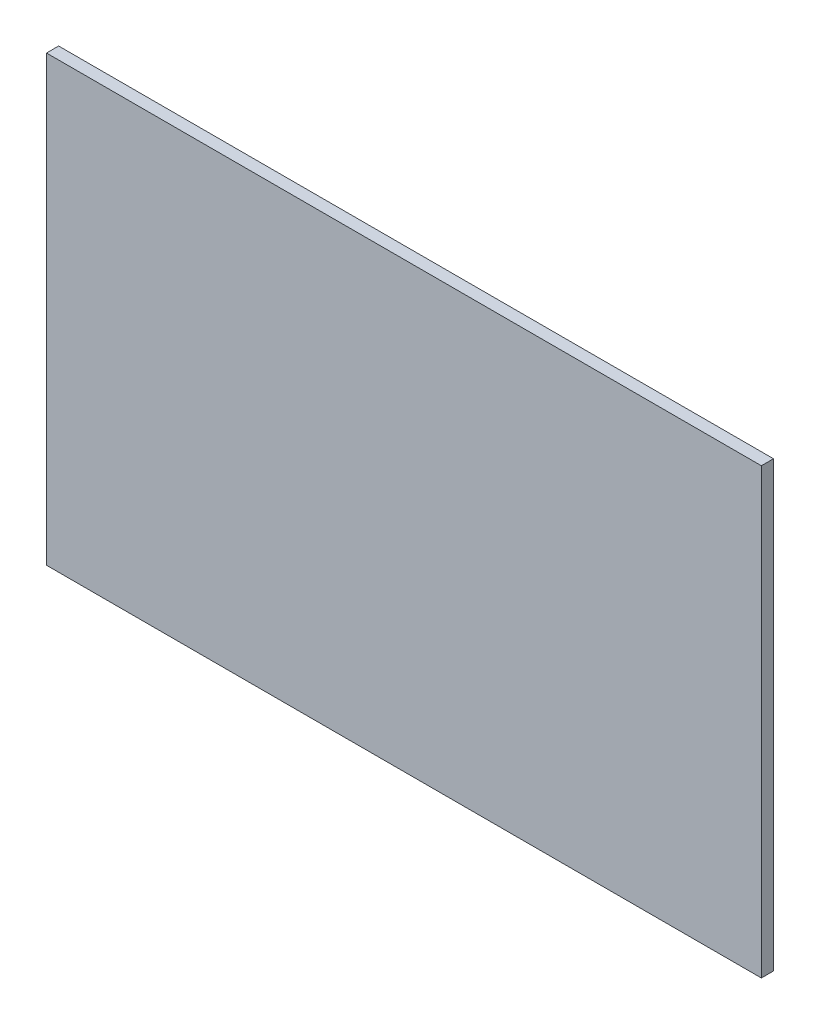
ISO-10303-21;
HEADER;
FILE_DESCRIPTION(('STEP AP214'),'2;1');
FILE_NAME('part.step','',(''),(''),'','','');
FILE_SCHEMA(('AUTOMOTIVE_DESIGN { 1 0 10303 214 1 1 1 1 }'));
ENDSEC;
DATA;
#1=APPLICATION_CONTEXT('core data for automotive mechanical design processes');
#2=APPLICATION_PROTOCOL_DEFINITION('international standard','automotive_design',2000,#1);
#3=PRODUCT_CONTEXT('',#1,'mechanical');
#4=PRODUCT('Part','Part','',(#3));
#5=PRODUCT_RELATED_PRODUCT_CATEGORY('part','',(#4));
#6=PRODUCT_DEFINITION_FORMATION('','',#4);
#7=PRODUCT_DEFINITION_CONTEXT('part definition',#1,'design');
#8=PRODUCT_DEFINITION('design','',#6,#7);
#9=PRODUCT_DEFINITION_SHAPE('','',#8);
#10=(LENGTH_UNIT() NAMED_UNIT(*) SI_UNIT(.MILLI.,.METRE.));
#11=(NAMED_UNIT(*) PLANE_ANGLE_UNIT() SI_UNIT($,.RADIAN.));
#12=(NAMED_UNIT(*) SI_UNIT($,.STERADIAN.) SOLID_ANGLE_UNIT());
#13=UNCERTAINTY_MEASURE_WITH_UNIT(LENGTH_MEASURE(1.E-05),#10,'distance_accuracy_value','');
#14=(GEOMETRIC_REPRESENTATION_CONTEXT(3) GLOBAL_UNCERTAINTY_ASSIGNED_CONTEXT((#13)) GLOBAL_UNIT_ASSIGNED_CONTEXT((#10,
#11,#12)) REPRESENTATION_CONTEXT('',''));
#15=CARTESIAN_POINT('',(0.,0.,0.));
#16=DIRECTION('',(0.,0.,1.));
#17=DIRECTION('',(1.,0.,0.));
#18=AXIS2_PLACEMENT_3D('',#15,#16,#17);
#19=CARTESIAN_POINT('',(134.497166297948,-87.4812268518355,5.));
#20=DIRECTION('',(-1.,0.,0.));
#21=DIRECTION('',(0.,0.,1.));
#22=AXIS2_PLACEMENT_3D('',#19,#20,#21);
#23=PLANE('',#22);
#24=DIRECTION('',(0.,1.,0.));
#25=VECTOR('',#24,1.);
#26=CARTESIAN_POINT('',(134.497166297948,-87.4812268518355,0.));
#27=LINE('',#26,#25);
#28=CARTESIAN_POINT('',(134.497166297948,-87.4812268518355,0.));
#29=VERTEX_POINT('',#28);
#30=CARTESIAN_POINT('',(134.497166297948,95.2250599993416,0.));
#31=VERTEX_POINT('',#30);
#32=EDGE_CURVE('E96',#29,#31,#27,.T.);
#33=ORIENTED_EDGE('',*,*,#32,.T.);
#34=DIRECTION('',(0.,0.,-1.));
#35=VECTOR('',#34,1.);
#36=CARTESIAN_POINT('',(134.497166297948,95.2250599993416,5.));
#37=LINE('',#36,#35);
#38=CARTESIAN_POINT('',(134.497166297948,95.2250599993416,5.));
#39=VERTEX_POINT('',#38);
#40=EDGE_CURVE('E11',#39,#31,#37,.T.);
#41=ORIENTED_EDGE('',*,*,#40,.F.);
#42=DIRECTION('',(0.,1.,0.));
#43=VECTOR('',#42,1.);
#44=CARTESIAN_POINT('',(134.497166297948,-87.4812268518355,5.));
#45=LINE('',#44,#43);
#46=CARTESIAN_POINT('',(134.497166297948,-87.4812268518355,5.));
#47=VERTEX_POINT('',#46);
#48=EDGE_CURVE('E84',#47,#39,#45,.T.);
#49=ORIENTED_EDGE('',*,*,#48,.F.);
#50=DIRECTION('',(0.,0.,-1.));
#51=VECTOR('',#50,1.);
#52=CARTESIAN_POINT('',(134.497166297948,-87.4812268518355,5.));
#53=LINE('',#52,#51);
#54=EDGE_CURVE('E92',#47,#29,#53,.T.);
#55=ORIENTED_EDGE('',*,*,#54,.T.);
#56=EDGE_LOOP('',(#33,#41,#49,#55));
#57=FACE_BOUND('',#56,.T.);
#58=ADVANCED_FACE('F33',(#57),#23,.F.);
#59=CARTESIAN_POINT('',(134.497166297948,95.2250599993416,5.));
#60=DIRECTION('',(0.,-1.,0.));
#61=DIRECTION('',(0.,0.,-1.));
#62=AXIS2_PLACEMENT_3D('',#59,#60,#61);
#63=PLANE('',#62);
#64=DIRECTION('',(-1.,0.,0.));
#65=VECTOR('',#64,1.);
#66=CARTESIAN_POINT('',(134.497166297948,95.2250599993416,0.));
#67=LINE('',#66,#65);
#68=CARTESIAN_POINT('',(-159.913063849217,95.2250599993416,0.));
#69=VERTEX_POINT('',#68);
#70=EDGE_CURVE('E88',#31,#69,#67,.T.);
#71=ORIENTED_EDGE('',*,*,#70,.T.);
#72=DIRECTION('',(0.,0.,-1.));
#73=VECTOR('',#72,1.);
#74=CARTESIAN_POINT('',(-159.913063849217,95.2250599993416,5.));
#75=LINE('',#74,#73);
#76=CARTESIAN_POINT('',(-159.913063849217,95.2250599993416,5.));
#77=VERTEX_POINT('',#76);
#78=EDGE_CURVE('E41',#77,#69,#75,.T.);
#79=ORIENTED_EDGE('',*,*,#78,.F.);
#80=DIRECTION('',(-1.,0.,0.));
#81=VECTOR('',#80,1.);
#82=CARTESIAN_POINT('',(134.497166297948,95.2250599993416,5.));
#83=LINE('',#82,#81);
#84=EDGE_CURVE('E79',#39,#77,#83,.T.);
#85=ORIENTED_EDGE('',*,*,#84,.F.);
#86=ORIENTED_EDGE('',*,*,#40,.T.);
#87=EDGE_LOOP('',(#71,#79,#85,#86));
#88=FACE_BOUND('',#87,.T.);
#89=ADVANCED_FACE('F87',(#88),#63,.F.);
#90=CARTESIAN_POINT('',(-159.913063849217,-87.4812268518355,5.));
#91=DIRECTION('',(1.,0.,0.));
#92=DIRECTION('',(0.,0.,-1.));
#93=AXIS2_PLACEMENT_3D('',#90,#91,#92);
#94=PLANE('',#93);
#95=DIRECTION('',(0.,-1.,0.));
#96=VECTOR('',#95,1.);
#97=CARTESIAN_POINT('',(-159.913063849217,-87.4812268518355,0.));
#98=LINE('',#97,#96);
#99=CARTESIAN_POINT('',(-159.913063849217,-87.4812268518355,0.));
#100=VERTEX_POINT('',#99);
#101=EDGE_CURVE('E66',#69,#100,#98,.T.);
#102=ORIENTED_EDGE('',*,*,#101,.T.);
#103=DIRECTION('',(0.,0.,-1.));
#104=VECTOR('',#103,1.);
#105=CARTESIAN_POINT('',(-159.913063849217,-87.4812268518355,5.));
#106=LINE('',#105,#104);
#107=CARTESIAN_POINT('',(-159.913063849217,-87.4812268518355,5.));
#108=VERTEX_POINT('',#107);
#109=EDGE_CURVE('E89',#108,#100,#106,.T.);
#110=ORIENTED_EDGE('',*,*,#109,.F.);
#111=DIRECTION('',(0.,-1.,0.));
#112=VECTOR('',#111,1.);
#113=CARTESIAN_POINT('',(-159.913063849217,-87.4812268518355,5.));
#114=LINE('',#113,#112);
#115=EDGE_CURVE('E82',#77,#108,#114,.T.);
#116=ORIENTED_EDGE('',*,*,#115,.F.);
#117=ORIENTED_EDGE('',*,*,#78,.T.);
#118=EDGE_LOOP('',(#102,#110,#116,#117));
#119=FACE_BOUND('',#118,.T.);
#120=ADVANCED_FACE('F90',(#119),#94,.F.);
#121=CARTESIAN_POINT('',(134.497166297948,-87.4812268518355,5.));
#122=DIRECTION('',(0.,1.,0.));
#123=DIRECTION('',(0.,0.,1.));
#124=AXIS2_PLACEMENT_3D('',#121,#122,#123);
#125=PLANE('',#124);
#126=DIRECTION('',(1.,0.,0.));
#127=VECTOR('',#126,1.);
#128=CARTESIAN_POINT('',(134.497166297948,-87.4812268518355,0.));
#129=LINE('',#128,#127);
#130=EDGE_CURVE('E72',#100,#29,#129,.T.);
#131=ORIENTED_EDGE('',*,*,#130,.T.);
#132=ORIENTED_EDGE('',*,*,#54,.F.);
#133=DIRECTION('',(1.,0.,0.));
#134=VECTOR('',#133,1.);
#135=CARTESIAN_POINT('',(134.497166297948,-87.4812268518355,5.));
#136=LINE('',#135,#134);
#137=EDGE_CURVE('E49',#108,#47,#136,.T.);
#138=ORIENTED_EDGE('',*,*,#137,.F.);
#139=ORIENTED_EDGE('',*,*,#109,.T.);
#140=EDGE_LOOP('',(#131,#132,#138,#139));
#141=FACE_BOUND('',#140,.T.);
#142=ADVANCED_FACE('F103',(#141),#125,.F.);
#143=CARTESIAN_POINT('',(0.,0.,5.));
#144=DIRECTION('',(0.,0.,1.));
#145=DIRECTION('',(1.,0.,0.));
#146=AXIS2_PLACEMENT_3D('',#143,#144,#145);
#147=PLANE('',#146);
#148=ORIENTED_EDGE('',*,*,#48,.T.);
#149=ORIENTED_EDGE('',*,*,#84,.T.);
#150=ORIENTED_EDGE('',*,*,#115,.T.);
#151=ORIENTED_EDGE('',*,*,#137,.T.);
#152=EDGE_LOOP('',(#148,#149,#150,#151));
#153=FACE_BOUND('',#152,.T.);
#154=ADVANCED_FACE('F80',(#153),#147,.T.);
#155=CARTESIAN_POINT('',(0.,0.,0.));
#156=DIRECTION('',(0.,0.,1.));
#157=DIRECTION('',(1.,0.,0.));
#158=AXIS2_PLACEMENT_3D('',#155,#156,#157);
#159=PLANE('',#158);
#160=ORIENTED_EDGE('',*,*,#32,.F.);
#161=ORIENTED_EDGE('',*,*,#130,.F.);
#162=ORIENTED_EDGE('',*,*,#101,.F.);
#163=ORIENTED_EDGE('',*,*,#70,.F.);
#164=EDGE_LOOP('',(#160,#161,#162,#163));
#165=FACE_BOUND('',#164,.T.);
#166=ADVANCED_FACE('F106',(#165),#159,.F.);
#167=CLOSED_SHELL('',(#58,#89,#120,#142,#154,#166));
#168=MANIFOLD_SOLID_BREP('B2',#167);
#169=ADVANCED_BREP_SHAPE_REPRESENTATION('',(#18,#168),#14);
#170=SHAPE_DEFINITION_REPRESENTATION(#9,#169);
ENDSEC;
END-ISO-10303-21;
